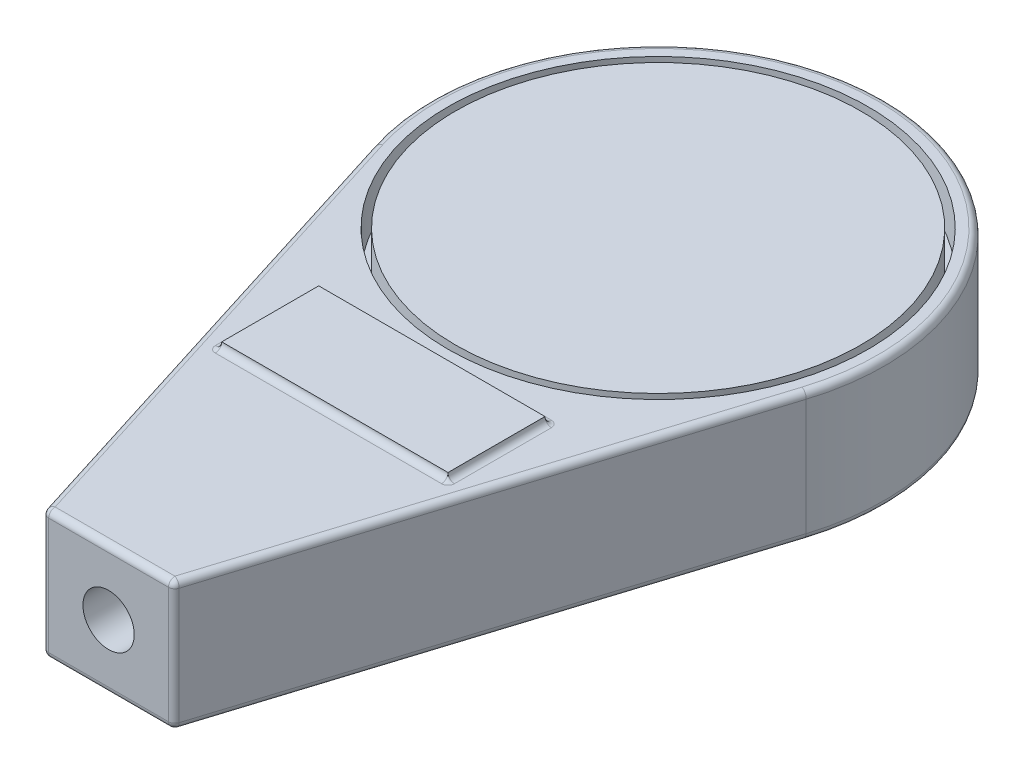
ISO-10303-21;
HEADER;
FILE_DESCRIPTION(('STEP AP214'),'2;1');
FILE_NAME('part.step','',(''),(''),'','','');
FILE_SCHEMA(('AUTOMOTIVE_DESIGN { 1 0 10303 214 1 1 1 1 }'));
ENDSEC;
DATA;
#1=APPLICATION_CONTEXT('core data for automotive mechanical design processes');
#2=APPLICATION_PROTOCOL_DEFINITION('international standard','automotive_design',2000,#1);
#3=PRODUCT_CONTEXT('',#1,'mechanical');
#4=PRODUCT('Part','Part','',(#3));
#5=PRODUCT_RELATED_PRODUCT_CATEGORY('part','',(#4));
#6=PRODUCT_DEFINITION_FORMATION('','',#4);
#7=PRODUCT_DEFINITION_CONTEXT('part definition',#1,'design');
#8=PRODUCT_DEFINITION('design','',#6,#7);
#9=PRODUCT_DEFINITION_SHAPE('','',#8);
#10=(LENGTH_UNIT() NAMED_UNIT(*) SI_UNIT(.MILLI.,.METRE.));
#11=(NAMED_UNIT(*) PLANE_ANGLE_UNIT() SI_UNIT($,.RADIAN.));
#12=(NAMED_UNIT(*) SI_UNIT($,.STERADIAN.) SOLID_ANGLE_UNIT());
#13=UNCERTAINTY_MEASURE_WITH_UNIT(LENGTH_MEASURE(1.E-05),#10,'distance_accuracy_value','');
#14=(GEOMETRIC_REPRESENTATION_CONTEXT(3) GLOBAL_UNCERTAINTY_ASSIGNED_CONTEXT((#13)) GLOBAL_UNIT_ASSIGNED_CONTEXT((#10,
#11,#12)) REPRESENTATION_CONTEXT('',''));
#15=CARTESIAN_POINT('',(0.,0.,0.));
#16=DIRECTION('',(0.,0.,1.));
#17=DIRECTION('',(1.,0.,0.));
#18=AXIS2_PLACEMENT_3D('',#15,#16,#17);
#19=CARTESIAN_POINT('',(0.,20.,0.));
#20=DIRECTION('',(0.,1.,0.));
#21=DIRECTION('',(0.,0.,1.));
#22=AXIS2_PLACEMENT_3D('',#19,#20,#21);
#23=PLANE('',#22);
#24=CARTESIAN_POINT('',(-17.5,20.,35.));
#25=DIRECTION('',(0.,1.,0.));
#26=DIRECTION('',(0.,0.,1.));
#27=AXIS2_PLACEMENT_3D('',#24,#25,#26);
#28=CIRCLE('',#27,1.);
#29=CARTESIAN_POINT('',(-17.5,20.,34.));
#30=VERTEX_POINT('',#29);
#31=CARTESIAN_POINT('',(-18.5,20.,35.));
#32=VERTEX_POINT('',#31);
#33=EDGE_CURVE('E235',#30,#32,#28,.T.);
#34=ORIENTED_EDGE('',*,*,#33,.F.);
#35=DIRECTION('',(1.,0.,0.));
#36=VECTOR('',#35,1.);
#37=CARTESIAN_POINT('',(17.5,20.,34.));
#38=LINE('',#37,#36);
#39=CARTESIAN_POINT('',(17.5,20.,34.));
#40=VERTEX_POINT('',#39);
#41=EDGE_CURVE('E253',#30,#40,#38,.T.);
#42=ORIENTED_EDGE('',*,*,#41,.T.);
#43=CARTESIAN_POINT('',(17.5,20.,35.));
#44=DIRECTION('',(0.,1.,0.));
#45=DIRECTION('',(0.,0.,1.));
#46=AXIS2_PLACEMENT_3D('',#43,#44,#45);
#47=CIRCLE('',#46,1.);
#48=CARTESIAN_POINT('',(18.5,20.,35.));
#49=VERTEX_POINT('',#48);
#50=EDGE_CURVE('E250',#49,#40,#47,.T.);
#51=ORIENTED_EDGE('',*,*,#50,.F.);
#52=DIRECTION('',(0.,0.,1.));
#53=VECTOR('',#52,1.);
#54=CARTESIAN_POINT('',(18.5,20.,50.));
#55=LINE('',#54,#53);
#56=CARTESIAN_POINT('',(18.5,20.,50.));
#57=VERTEX_POINT('',#56);
#58=EDGE_CURVE('E248',#49,#57,#55,.T.);
#59=ORIENTED_EDGE('',*,*,#58,.T.);
#60=CARTESIAN_POINT('',(17.5,20.,50.));
#61=DIRECTION('',(0.,1.,0.));
#62=DIRECTION('',(0.,0.,1.));
#63=AXIS2_PLACEMENT_3D('',#60,#61,#62);
#64=CIRCLE('',#63,1.);
#65=CARTESIAN_POINT('',(17.5,20.,51.));
#66=VERTEX_POINT('',#65);
#67=EDGE_CURVE('E245',#66,#57,#64,.T.);
#68=ORIENTED_EDGE('',*,*,#67,.F.);
#69=DIRECTION('',(1.,0.,0.));
#70=VECTOR('',#69,1.);
#71=CARTESIAN_POINT('',(0.,20.,51.));
#72=LINE('',#71,#70);
#73=CARTESIAN_POINT('',(-17.5,20.,51.));
#74=VERTEX_POINT('',#73);
#75=EDGE_CURVE('E243',#66,#74,#72,.F.);
#76=ORIENTED_EDGE('',*,*,#75,.T.);
#77=CARTESIAN_POINT('',(-17.5,20.,50.));
#78=DIRECTION('',(0.,1.,0.));
#79=DIRECTION('',(0.,0.,1.));
#80=AXIS2_PLACEMENT_3D('',#77,#78,#79);
#81=CIRCLE('',#80,1.);
#82=CARTESIAN_POINT('',(-18.5,20.,50.));
#83=VERTEX_POINT('',#82);
#84=EDGE_CURVE('E240',#83,#74,#81,.T.);
#85=ORIENTED_EDGE('',*,*,#84,.F.);
#86=DIRECTION('',(0.,0.,1.));
#87=VECTOR('',#86,1.);
#88=CARTESIAN_POINT('',(-18.5,20.,0.));
#89=LINE('',#88,#87);
#90=EDGE_CURVE('E238',#83,#32,#89,.F.);
#91=ORIENTED_EDGE('',*,*,#90,.T.);
#92=EDGE_LOOP('',(#34,#42,#51,#59,#68,#76,#85,#91));
#93=FACE_BOUND('',#92,.T.);
#94=DIRECTION('',(1.,0.,0.));
#95=VECTOR('',#94,1.);
#96=CARTESIAN_POINT('',(10.,20.,84.));
#97=LINE('',#96,#95);
#98=CARTESIAN_POINT('',(-9.26581252700777,20.,84.));
#99=VERTEX_POINT('',#98);
#100=CARTESIAN_POINT('',(9.26581252700777,20.,84.));
#101=VERTEX_POINT('',#100);
#102=EDGE_CURVE('E228',#99,#101,#97,.T.);
#103=ORIENTED_EDGE('',*,*,#102,.T.);
#104=DIRECTION('',(0.299518775755541,0.,-0.954090406077905));
#105=VECTOR('',#104,1.);
#106=CARTESIAN_POINT('',(32.4390738066488,20.,10.1836383756884));
#107=LINE('',#106,#105);
#108=CARTESIAN_POINT('',(32.4390738066488,20.,10.1836383756884));
#109=VERTEX_POINT('',#108);
#110=EDGE_CURVE('E232',#101,#109,#107,.T.);
#111=ORIENTED_EDGE('',*,*,#110,.T.);
#112=CARTESIAN_POINT('',(0.,20.,0.));
#113=DIRECTION('',(0.,1.,0.));
#114=DIRECTION('',(0.,0.,1.));
#115=AXIS2_PLACEMENT_3D('',#112,#113,#114);
#116=CIRCLE('',#115,34.);
#117=CARTESIAN_POINT('',(-32.4390738066488,20.,10.1836383756884));
#118=VERTEX_POINT('',#117);
#119=EDGE_CURVE('E230',#109,#118,#116,.T.);
#120=ORIENTED_EDGE('',*,*,#119,.T.);
#121=DIRECTION('',(0.299518775755541,0.,0.954090406077905));
#122=VECTOR('',#121,1.);
#123=CARTESIAN_POINT('',(-9.04590959392208,20.,84.7004812242445));
#124=LINE('',#123,#122);
#125=EDGE_CURVE('E226',#118,#99,#124,.T.);
#126=ORIENTED_EDGE('',*,*,#125,.T.);
#127=EDGE_LOOP('',(#103,#111,#120,#126));
#128=FACE_BOUND('',#127,.T.);
#129=CARTESIAN_POINT('',(0.,20.,0.));
#130=DIRECTION('',(0.,1.,0.));
#131=DIRECTION('',(0.,0.,1.));
#132=AXIS2_PLACEMENT_3D('',#129,#130,#131);
#133=CIRCLE('',#132,32.5);
#134=CARTESIAN_POINT('',(0.,20.,32.5));
#135=VERTEX_POINT('',#134);
#136=EDGE_CURVE('E200',#135,#135,#133,.T.);
#137=ORIENTED_EDGE('',*,*,#136,.F.);
#138=EDGE_LOOP('',(#137));
#139=FACE_BOUND('',#138,.T.);
#140=ADVANCED_FACE('F51',(#93,#128,#139),#23,.T.);
#141=CARTESIAN_POINT('',(0.,20.,0.));
#142=DIRECTION('',(0.,-1.,0.));
#143=DIRECTION('',(0.,0.,-1.));
#144=AXIS2_PLACEMENT_3D('',#141,#142,#143);
#145=CYLINDRICAL_SURFACE('',#144,35.);
#146=DIRECTION('',(0.,-1.,0.));
#147=VECTOR('',#146,1.);
#148=CARTESIAN_POINT('',(33.3931642127267,120.065845984876,10.4831571514439));
#149=LINE('',#148,#147);
#150=CARTESIAN_POINT('',(33.3931642127267,19.,10.4831571514439));
#151=VERTEX_POINT('',#150);
#152=CARTESIAN_POINT('',(33.3931642127267,1.,10.4831571514439));
#153=VERTEX_POINT('',#152);
#154=EDGE_CURVE('E189',#151,#153,#149,.T.);
#155=ORIENTED_EDGE('',*,*,#154,.T.);
#156=CARTESIAN_POINT('',(0.,1.,0.));
#157=DIRECTION('',(0.,1.,0.));
#158=DIRECTION('',(0.,0.,1.));
#159=AXIS2_PLACEMENT_3D('',#156,#157,#158);
#160=CIRCLE('',#159,35.);
#161=CARTESIAN_POINT('',(-33.3931642127267,1.,10.4831571514439));
#162=VERTEX_POINT('',#161);
#163=EDGE_CURVE('E224',#153,#162,#160,.T.);
#164=ORIENTED_EDGE('',*,*,#163,.T.);
#165=DIRECTION('',(0.,-1.,0.));
#166=VECTOR('',#165,1.);
#167=CARTESIAN_POINT('',(-33.3931642127267,120.065845984876,10.4831571514439));
#168=LINE('',#167,#166);
#169=CARTESIAN_POINT('',(-33.3931642127267,19.,10.4831571514439));
#170=VERTEX_POINT('',#169);
#171=EDGE_CURVE('E190',#170,#162,#168,.T.);
#172=ORIENTED_EDGE('',*,*,#171,.F.);
#173=CARTESIAN_POINT('',(0.,19.,0.));
#174=DIRECTION('',(0.,1.,0.));
#175=DIRECTION('',(0.,0.,1.));
#176=AXIS2_PLACEMENT_3D('',#173,#174,#175);
#177=CIRCLE('',#176,35.);
#178=EDGE_CURVE('E222',#170,#151,#177,.F.);
#179=ORIENTED_EDGE('',*,*,#178,.T.);
#180=EDGE_LOOP('',(#155,#164,#172,#179));
#181=FACE_BOUND('',#180,.T.);
#182=ADVANCED_FACE('F372',(#181),#145,.T.);
#183=CARTESIAN_POINT('',(0.,0.,0.));
#184=DIRECTION('',(0.,1.,0.));
#185=DIRECTION('',(0.,0.,1.));
#186=AXIS2_PLACEMENT_3D('',#183,#184,#185);
#187=PLANE('',#186);
#188=CARTESIAN_POINT('',(0.,0.,0.));
#189=DIRECTION('',(0.,1.,0.));
#190=DIRECTION('',(0.,0.,1.));
#191=AXIS2_PLACEMENT_3D('',#188,#189,#190);
#192=CIRCLE('',#191,34.);
#193=CARTESIAN_POINT('',(-32.4390738066488,0.,10.1836383756884));
#194=VERTEX_POINT('',#193);
#195=CARTESIAN_POINT('',(32.4390738066488,0.,10.1836383756884));
#196=VERTEX_POINT('',#195);
#197=EDGE_CURVE('E217',#194,#196,#192,.F.);
#198=ORIENTED_EDGE('',*,*,#197,.T.);
#199=DIRECTION('',(0.299518775755541,0.,-0.954090406077905));
#200=VECTOR('',#199,1.);
#201=CARTESIAN_POINT('',(32.4390738066488,0.,10.1836383756884));
#202=LINE('',#201,#200);
#203=CARTESIAN_POINT('',(9.26581252700778,0.,84.));
#204=VERTEX_POINT('',#203);
#205=EDGE_CURVE('E219',#196,#204,#202,.F.);
#206=ORIENTED_EDGE('',*,*,#205,.T.);
#207=DIRECTION('',(1.,0.,0.));
#208=VECTOR('',#207,1.);
#209=CARTESIAN_POINT('',(0.,0.,84.));
#210=LINE('',#209,#208);
#211=CARTESIAN_POINT('',(-9.26581252700777,0.,84.));
#212=VERTEX_POINT('',#211);
#213=EDGE_CURVE('E215',#204,#212,#210,.F.);
#214=ORIENTED_EDGE('',*,*,#213,.T.);
#215=DIRECTION('',(0.299518775755541,0.,0.954090406077905));
#216=VECTOR('',#215,1.);
#217=CARTESIAN_POINT('',(-32.4390738066488,0.,10.1836383756884));
#218=LINE('',#217,#216);
#219=EDGE_CURVE('E213',#212,#194,#218,.F.);
#220=ORIENTED_EDGE('',*,*,#219,.T.);
#221=EDGE_LOOP('',(#198,#206,#214,#220));
#222=FACE_BOUND('',#221,.T.);
#223=ADVANCED_FACE('F379',(#222),#187,.F.);
#224=CARTESIAN_POINT('',(0.,13.5,0.));
#225=DIRECTION('',(0.,1.,0.));
#226=DIRECTION('',(0.,0.,1.));
#227=AXIS2_PLACEMENT_3D('',#224,#225,#226);
#228=CYLINDRICAL_SURFACE('',#227,32.5);
#229=CARTESIAN_POINT('',(0.,13.5,0.));
#230=DIRECTION('',(0.,1.,0.));
#231=DIRECTION('',(0.,0.,1.));
#232=AXIS2_PLACEMENT_3D('',#229,#230,#231);
#233=CIRCLE('',#232,32.5);
#234=CARTESIAN_POINT('',(0.,13.5,32.5));
#235=VERTEX_POINT('',#234);
#236=EDGE_CURVE('E201',#235,#235,#233,.T.);
#237=CARTESIAN_POINT('',(0.,13.5,32.5));
#238=CARTESIAN_POINT('',(0.,13.5677083333333,32.5));
#239=CARTESIAN_POINT('',(0.,13.6354166666667,32.5));
#240=CARTESIAN_POINT('',(0.,13.7708333333333,32.5));
#241=CARTESIAN_POINT('',(0.,13.8385416666667,32.5));
#242=CARTESIAN_POINT('',(0.,13.9739583333333,32.5));
#243=CARTESIAN_POINT('',(0.,14.0416666666667,32.5));
#244=CARTESIAN_POINT('',(0.,14.1770833333333,32.5));
#245=CARTESIAN_POINT('',(0.,14.2447916666667,32.5));
#246=CARTESIAN_POINT('',(0.,14.3802083333333,32.5));
#247=CARTESIAN_POINT('',(0.,14.4479166666667,32.5));
#248=CARTESIAN_POINT('',(0.,14.5833333333333,32.5));
#249=CARTESIAN_POINT('',(0.,14.6510416666667,32.5));
#250=CARTESIAN_POINT('',(0.,14.7864583333333,32.5));
#251=CARTESIAN_POINT('',(0.,14.8541666666667,32.5));
#252=CARTESIAN_POINT('',(0.,14.9895833333333,32.5));
#253=CARTESIAN_POINT('',(0.,15.0572916666667,32.5));
#254=CARTESIAN_POINT('',(0.,15.1927083333333,32.5));
#255=CARTESIAN_POINT('',(0.,15.2604166666667,32.5));
#256=CARTESIAN_POINT('',(0.,15.3958333333333,32.5));
#257=CARTESIAN_POINT('',(0.,15.4635416666667,32.5));
#258=CARTESIAN_POINT('',(0.,15.5989583333333,32.5));
#259=CARTESIAN_POINT('',(0.,15.6666666666667,32.5));
#260=CARTESIAN_POINT('',(0.,15.8020833333333,32.5));
#261=CARTESIAN_POINT('',(0.,15.8697916666667,32.5));
#262=CARTESIAN_POINT('',(0.,16.0052083333333,32.5));
#263=CARTESIAN_POINT('',(0.,16.0729166666667,32.5));
#264=CARTESIAN_POINT('',(0.,16.2083333333333,32.5));
#265=CARTESIAN_POINT('',(0.,16.2760416666667,32.5));
#266=CARTESIAN_POINT('',(0.,16.4114583333333,32.5));
#267=CARTESIAN_POINT('',(0.,16.4791666666667,32.5));
#268=CARTESIAN_POINT('',(0.,16.6145833333333,32.5));
#269=CARTESIAN_POINT('',(0.,16.6822916666667,32.5));
#270=CARTESIAN_POINT('',(0.,16.8177083333333,32.5));
#271=CARTESIAN_POINT('',(0.,16.8854166666667,32.5));
#272=CARTESIAN_POINT('',(0.,17.0208333333333,32.5));
#273=CARTESIAN_POINT('',(0.,17.0885416666667,32.5));
#274=CARTESIAN_POINT('',(0.,17.2239583333333,32.5));
#275=CARTESIAN_POINT('',(0.,17.2916666666667,32.5));
#276=CARTESIAN_POINT('',(0.,17.4270833333333,32.5));
#277=CARTESIAN_POINT('',(0.,17.4947916666667,32.5));
#278=CARTESIAN_POINT('',(0.,17.6302083333333,32.5));
#279=CARTESIAN_POINT('',(0.,17.6979166666667,32.5));
#280=CARTESIAN_POINT('',(0.,17.8333333333333,32.5));
#281=CARTESIAN_POINT('',(0.,17.9010416666667,32.5));
#282=CARTESIAN_POINT('',(0.,18.0364583333333,32.5));
#283=CARTESIAN_POINT('',(0.,18.1041666666667,32.5));
#284=CARTESIAN_POINT('',(0.,18.2395833333333,32.5));
#285=CARTESIAN_POINT('',(0.,18.3072916666667,32.5));
#286=CARTESIAN_POINT('',(0.,18.4427083333333,32.5));
#287=CARTESIAN_POINT('',(0.,18.5104166666667,32.5));
#288=CARTESIAN_POINT('',(0.,18.6458333333333,32.5));
#289=CARTESIAN_POINT('',(0.,18.7135416666667,32.5));
#290=CARTESIAN_POINT('',(0.,18.8489583333333,32.5));
#291=CARTESIAN_POINT('',(0.,18.9166666666667,32.5));
#292=CARTESIAN_POINT('',(0.,19.0520833333333,32.5));
#293=CARTESIAN_POINT('',(0.,19.1197916666667,32.5));
#294=CARTESIAN_POINT('',(0.,19.2552083333333,32.5));
#295=CARTESIAN_POINT('',(0.,19.3229166666667,32.5));
#296=CARTESIAN_POINT('',(0.,19.4583333333333,32.5));
#297=CARTESIAN_POINT('',(0.,19.5260416666667,32.5));
#298=CARTESIAN_POINT('',(0.,19.6614583333333,32.5));
#299=CARTESIAN_POINT('',(0.,19.7291666666667,32.5));
#300=CARTESIAN_POINT('',(0.,19.8645833333333,32.5));
#301=CARTESIAN_POINT('',(0.,19.9322916666667,32.5));
#302=CARTESIAN_POINT('',(0.,20.,32.5));
#303=B_SPLINE_CURVE_WITH_KNOTS('',3,(#237,#238,#239,#240,#241,#242,#243,#244,#245,#246,#247,
#248,#249,#250,#251,#252,#253,#254,#255,#256,#257,#258,#259,#260,#261,#262,#263,#264,#265,#266,
#267,#268,#269,#270,#271,#272,#273,#274,#275,#276,#277,#278,#279,#280,#281,#282,#283,#284,#285,
#286,#287,#288,#289,#290,#291,#292,#293,#294,#295,#296,#297,#298,#299,#300,#301,#302),
.UNSPECIFIED.,.F.,.F.,(4,2,2,2,2,2,2,2,2,2,2,2,2,2,2,2,2,2,2,2,2,2,2,2,2,2,2,2,2,2,2,2,4),(0.,
0.203125,0.40625,0.609375000000001,0.812500000000001,1.015625,1.21875,1.421875,1.625,1.828125,
2.03125,2.234375,2.4375,2.640625,2.84375,3.046875,3.25,3.453125,3.65625,3.859375,4.0625,
4.265625,4.46875,4.671875,4.875,5.078125,5.28125,5.484375,5.6875,5.890625,6.09375,6.296875,6.5),.UNSPECIFIED.);
#304=EDGE_CURVE('BSEAM384',#235,#135,#303,.T.);
#305=ORIENTED_EDGE('',*,*,#236,.F.);
#306=ORIENTED_EDGE('',*,*,#136,.T.);
#307=ORIENTED_EDGE('',*,*,#304,.T.);
#308=ORIENTED_EDGE('',*,*,#304,.F.);
#309=EDGE_LOOP('',(#305,#307,#306,#308));
#310=FACE_BOUND('',#309,.T.);
#311=ADVANCED_FACE('F384',(#310),#228,.F.);
#312=CARTESIAN_POINT('',(0.,13.5,0.));
#313=DIRECTION('',(0.,1.,0.));
#314=DIRECTION('',(0.,0.,1.));
#315=AXIS2_PLACEMENT_3D('',#312,#313,#314);
#316=PLANE('',#315);
#317=CARTESIAN_POINT('',(0.,13.5,0.));
#318=DIRECTION('',(0.,1.,0.));
#319=DIRECTION('',(0.,0.,1.));
#320=AXIS2_PLACEMENT_3D('',#317,#318,#319);
#321=CIRCLE('',#320,31.35);
#322=CARTESIAN_POINT('',(0.,13.5,31.35));
#323=VERTEX_POINT('',#322);
#324=EDGE_CURVE('E192',#323,#323,#321,.T.);
#325=ORIENTED_EDGE('',*,*,#324,.F.);
#326=EDGE_LOOP('',(#325));
#327=FACE_BOUND('',#326,.T.);
#328=ORIENTED_EDGE('',*,*,#236,.T.);
#329=EDGE_LOOP('',(#328));
#330=FACE_BOUND('',#329,.T.);
#331=ADVANCED_FACE('F505',(#327,#330),#316,.T.);
#332=CARTESIAN_POINT('',(0.,108.671190360793,0.));
#333=DIRECTION('',(0.,-1.,0.));
#334=DIRECTION('',(0.,0.,-1.));
#335=AXIS2_PLACEMENT_3D('',#332,#333,#334);
#336=CYLINDRICAL_SURFACE('',#335,31.35);
#337=ORIENTED_EDGE('',*,*,#324,.T.);
#338=EDGE_LOOP('',(#337));
#339=FACE_BOUND('',#338,.T.);
#340=CARTESIAN_POINT('',(0.,20.,0.));
#341=DIRECTION('',(0.,1.,0.));
#342=DIRECTION('',(0.,0.,1.));
#343=AXIS2_PLACEMENT_3D('',#340,#341,#342);
#344=CIRCLE('',#343,31.35);
#345=CARTESIAN_POINT('',(0.,20.,31.35));
#346=VERTEX_POINT('',#345);
#347=EDGE_CURVE('E197',#346,#346,#344,.T.);
#348=ORIENTED_EDGE('',*,*,#347,.F.);
#349=EDGE_LOOP('',(#348));
#350=FACE_BOUND('',#349,.T.);
#351=ADVANCED_FACE('F502',(#339,#350),#336,.T.);
#352=CARTESIAN_POINT('',(0.,20.,0.));
#353=DIRECTION('',(0.,1.,0.));
#354=DIRECTION('',(0.,0.,1.));
#355=AXIS2_PLACEMENT_3D('',#352,#353,#354);
#356=PLANE('',#355);
#357=ORIENTED_EDGE('',*,*,#347,.T.);
#358=EDGE_LOOP('',(#357));
#359=FACE_BOUND('',#358,.T.);
#360=ADVANCED_FACE('F498',(#359),#356,.T.);
#361=CARTESIAN_POINT('',(-33.3931642127267,120.065845984876,10.4831571514439));
#362=DIRECTION('',(0.954090406077905,0.,-0.299518775755541));
#363=DIRECTION('',(-0.299518775755541,0.,-0.954090406077905));
#364=AXIS2_PLACEMENT_3D('',#361,#362,#363);
#365=PLANE('',#364);
#366=ORIENTED_EDGE('',*,*,#171,.T.);
#367=DIRECTION('',(0.299518775755541,0.,0.954090406077905));
#368=VECTOR('',#367,1.);
#369=CARTESIAN_POINT('',(-33.3931642127267,1.,10.4831571514439));
#370=LINE('',#369,#368);
#371=CARTESIAN_POINT('',(-10.2199029330857,1.,84.2995187757555));
#372=VERTEX_POINT('',#371);
#373=EDGE_CURVE('E13',#162,#372,#370,.T.);
#374=ORIENTED_EDGE('',*,*,#373,.T.);
#375=DIRECTION('',(0.,-1.,0.));
#376=VECTOR('',#375,1.);
#377=CARTESIAN_POINT('',(-10.2199029330857,120.065845984876,84.2995187757556));
#378=LINE('',#377,#376);
#379=CARTESIAN_POINT('',(-10.2199029330857,19.,84.2995187757555));
#380=VERTEX_POINT('',#379);
#381=EDGE_CURVE('E60',#372,#380,#378,.F.);
#382=ORIENTED_EDGE('',*,*,#381,.T.);
#383=DIRECTION('',(0.299518775755541,0.,0.954090406077905));
#384=VECTOR('',#383,1.);
#385=CARTESIAN_POINT('',(-33.3931642127267,19.,10.4831571514439));
#386=LINE('',#385,#384);
#387=EDGE_CURVE('E265',#380,#170,#386,.F.);
#388=ORIENTED_EDGE('',*,*,#387,.T.);
#389=EDGE_LOOP('',(#366,#374,#382,#388));
#390=FACE_BOUND('',#389,.T.);
#391=ADVANCED_FACE('F477',(#390),#365,.F.);
#392=CARTESIAN_POINT('',(0.,120.065845984876,85.));
#393=DIRECTION('',(0.,0.,-1.));
#394=DIRECTION('',(-1.,0.,0.));
#395=AXIS2_PLACEMENT_3D('',#392,#393,#394);
#396=PLANE('',#395);
#397=DIRECTION('',(1.,0.,0.));
#398=VECTOR('',#397,1.);
#399=CARTESIAN_POINT('',(0.,1.,85.));
#400=LINE('',#399,#398);
#401=CARTESIAN_POINT('',(-9.26581252700778,1.,85.));
#402=VERTEX_POINT('',#401);
#403=CARTESIAN_POINT('',(9.26581252700778,1.,85.));
#404=VERTEX_POINT('',#403);
#405=EDGE_CURVE('E260',#402,#404,#400,.T.);
#406=ORIENTED_EDGE('',*,*,#405,.T.);
#407=DIRECTION('',(0.,-1.,0.));
#408=VECTOR('',#407,1.);
#409=CARTESIAN_POINT('',(9.26581252700778,120.065845984876,85.));
#410=LINE('',#409,#408);
#411=CARTESIAN_POINT('',(9.26581252700778,19.,85.));
#412=VERTEX_POINT('',#411);
#413=EDGE_CURVE('E262',#404,#412,#410,.F.);
#414=ORIENTED_EDGE('',*,*,#413,.T.);
#415=DIRECTION('',(1.,0.,0.));
#416=VECTOR('',#415,1.);
#417=CARTESIAN_POINT('',(-9.99999999999999,19.,85.));
#418=LINE('',#417,#416);
#419=CARTESIAN_POINT('',(-9.26581252700778,19.,85.));
#420=VERTEX_POINT('',#419);
#421=EDGE_CURVE('E256',#412,#420,#418,.F.);
#422=ORIENTED_EDGE('',*,*,#421,.T.);
#423=DIRECTION('',(0.,-1.,0.));
#424=VECTOR('',#423,1.);
#425=CARTESIAN_POINT('',(-9.26581252700778,120.065845984876,85.));
#426=LINE('',#425,#424);
#427=EDGE_CURVE('E258',#420,#402,#426,.T.);
#428=ORIENTED_EDGE('',*,*,#427,.T.);
#429=EDGE_LOOP('',(#406,#414,#422,#428));
#430=FACE_BOUND('',#429,.T.);
#431=CARTESIAN_POINT('',(0.,10.,85.));
#432=DIRECTION('',(0.,0.,1.));
#433=DIRECTION('',(1.,0.,0.));
#434=AXIS2_PLACEMENT_3D('',#431,#432,#433);
#435=CIRCLE('',#434,3.96874999999999);
#436=CARTESIAN_POINT('',(3.96874999999999,10.,85.));
#437=VERTEX_POINT('',#436);
#438=EDGE_CURVE('E174',#437,#437,#435,.T.);
#439=ORIENTED_EDGE('',*,*,#438,.F.);
#440=EDGE_LOOP('',(#439));
#441=FACE_BOUND('',#440,.T.);
#442=ADVANCED_FACE('F484',(#430,#441),#396,.F.);
#443=CARTESIAN_POINT('',(33.3931642127267,120.065845984876,10.4831571514439));
#444=DIRECTION('',(-0.954090406077905,0.,-0.299518775755541));
#445=DIRECTION('',(-0.299518775755541,0.,0.954090406077905));
#446=AXIS2_PLACEMENT_3D('',#443,#444,#445);
#447=PLANE('',#446);
#448=DIRECTION('',(0.,-1.,0.));
#449=VECTOR('',#448,1.);
#450=CARTESIAN_POINT('',(10.2199029330857,120.065845984876,84.2995187757556));
#451=LINE('',#450,#449);
#452=CARTESIAN_POINT('',(10.2199029330857,19.,84.2995187757555));
#453=VERTEX_POINT('',#452);
#454=CARTESIAN_POINT('',(10.2199029330857,1.,84.2995187757555));
#455=VERTEX_POINT('',#454);
#456=EDGE_CURVE('E204',#453,#455,#451,.T.);
#457=ORIENTED_EDGE('',*,*,#456,.T.);
#458=DIRECTION('',(0.299518775755541,0.,-0.954090406077905));
#459=VECTOR('',#458,1.);
#460=CARTESIAN_POINT('',(33.3931642127267,1.,10.4831571514439));
#461=LINE('',#460,#459);
#462=EDGE_CURVE('E210',#455,#153,#461,.T.);
#463=ORIENTED_EDGE('',*,*,#462,.T.);
#464=ORIENTED_EDGE('',*,*,#154,.F.);
#465=DIRECTION('',(0.299518775755541,0.,-0.954090406077905));
#466=VECTOR('',#465,1.);
#467=CARTESIAN_POINT('',(9.99999999999999,19.,85.));
#468=LINE('',#467,#466);
#469=EDGE_CURVE('E208',#151,#453,#468,.F.);
#470=ORIENTED_EDGE('',*,*,#469,.T.);
#471=EDGE_LOOP('',(#457,#463,#464,#470));
#472=FACE_BOUND('',#471,.T.);
#473=ADVANCED_FACE('F467',(#472),#447,.F.);
#474=CARTESIAN_POINT('',(0.,21.,0.));
#475=DIRECTION('',(0.,1.,0.));
#476=DIRECTION('',(0.,0.,1.));
#477=AXIS2_PLACEMENT_3D('',#474,#475,#476);
#478=PLANE('',#477);
#479=DIRECTION('',(0.,0.,1.));
#480=VECTOR('',#479,1.);
#481=CARTESIAN_POINT('',(-17.5,21.,35.));
#482=LINE('',#481,#480);
#483=CARTESIAN_POINT('',(-17.5,21.,35.));
#484=VERTEX_POINT('',#483);
#485=CARTESIAN_POINT('',(-17.5,21.,50.));
#486=VERTEX_POINT('',#485);
#487=EDGE_CURVE('E173',#484,#486,#482,.T.);
#488=ORIENTED_EDGE('',*,*,#487,.T.);
#489=DIRECTION('',(1.,0.,0.));
#490=VECTOR('',#489,1.);
#491=CARTESIAN_POINT('',(-17.5,21.,50.));
#492=LINE('',#491,#490);
#493=CARTESIAN_POINT('',(17.5,21.,50.));
#494=VERTEX_POINT('',#493);
#495=EDGE_CURVE('E176',#486,#494,#492,.T.);
#496=ORIENTED_EDGE('',*,*,#495,.T.);
#497=DIRECTION('',(0.,0.,1.));
#498=VECTOR('',#497,1.);
#499=CARTESIAN_POINT('',(17.5,21.,35.));
#500=LINE('',#499,#498);
#501=CARTESIAN_POINT('',(17.5,21.,35.));
#502=VERTEX_POINT('',#501);
#503=EDGE_CURVE('E183',#502,#494,#500,.T.);
#504=ORIENTED_EDGE('',*,*,#503,.F.);
#505=DIRECTION('',(1.,0.,0.));
#506=VECTOR('',#505,1.);
#507=CARTESIAN_POINT('',(-17.5,21.,35.));
#508=LINE('',#507,#506);
#509=EDGE_CURVE('E186',#484,#502,#508,.T.);
#510=ORIENTED_EDGE('',*,*,#509,.F.);
#511=EDGE_LOOP('',(#488,#496,#504,#510));
#512=FACE_BOUND('',#511,.T.);
#513=ADVANCED_FACE('F167',(#512),#478,.T.);
#514=CARTESIAN_POINT('',(0.,10.,45.));
#515=DIRECTION('',(0.,0.,1.));
#516=DIRECTION('',(1.,0.,0.));
#517=AXIS2_PLACEMENT_3D('',#514,#515,#516);
#518=CONICAL_SURFACE('',#517,3.96874999999999,1.02974425867665);
#519=CARTESIAN_POINT('',(0.,10.,42.6153344182344));
#520=VERTEX_POINT('',#519);
#521=VERTEX_LOOP('',#520);
#522=FACE_BOUND('',#521,.T.);
#523=CARTESIAN_POINT('',(0.,10.,45.));
#524=DIRECTION('',(0.,0.,1.));
#525=DIRECTION('',(1.,0.,0.));
#526=AXIS2_PLACEMENT_3D('',#523,#524,#525);
#527=CIRCLE('',#526,3.96874999999999);
#528=CARTESIAN_POINT('',(3.96874999999999,10.,45.));
#529=VERTEX_POINT('',#528);
#530=EDGE_CURVE('E171',#529,#529,#527,.T.);
#531=ORIENTED_EDGE('',*,*,#530,.T.);
#532=EDGE_LOOP('',(#531));
#533=FACE_BOUND('',#532,.T.);
#534=ADVANCED_FACE('F163',(#522,#533),#518,.F.);
#535=CARTESIAN_POINT('',(0.,10.,85.));
#536=DIRECTION('',(0.,0.,1.));
#537=DIRECTION('',(1.,0.,0.));
#538=AXIS2_PLACEMENT_3D('',#535,#536,#537);
#539=CYLINDRICAL_SURFACE('',#538,3.96874999999999);
#540=ORIENTED_EDGE('',*,*,#530,.F.);
#541=EDGE_LOOP('',(#540));
#542=FACE_BOUND('',#541,.T.);
#543=ORIENTED_EDGE('',*,*,#438,.T.);
#544=EDGE_LOOP('',(#543));
#545=FACE_BOUND('',#544,.T.);
#546=ADVANCED_FACE('F166',(#542,#545),#539,.F.);
#547=CARTESIAN_POINT('',(-32.4390738066488,19.,10.1836383756884));
#548=DIRECTION('',(-0.299518775755541,0.,-0.954090406077905));
#549=DIRECTION('',(-0.954090406077905,0.,0.299518775755541));
#550=AXIS2_PLACEMENT_3D('',#547,#548,#549);
#551=CYLINDRICAL_SURFACE('',#550,1.);
#552=CARTESIAN_POINT('',(-9.26581252700777,19.,84.));
#553=DIRECTION('',(0.29951877575554,0.,0.954090406077905));
#554=DIRECTION('',(0.954090406077906,0.,-0.29951877575554));
#555=AXIS2_PLACEMENT_3D('',#552,#553,#554);
#556=CIRCLE('',#555,1.);
#557=EDGE_CURVE('E306',#99,#380,#556,.T.);
#558=ORIENTED_EDGE('',*,*,#557,.F.);
#559=ORIENTED_EDGE('',*,*,#125,.F.);
#560=CARTESIAN_POINT('',(-32.4390738066488,19.,10.1836383756884));
#561=DIRECTION('',(-0.29951877575554,0.,-0.954090406077905));
#562=DIRECTION('',(-0.954090406077906,0.,0.29951877575554));
#563=AXIS2_PLACEMENT_3D('',#560,#561,#562);
#564=CIRCLE('',#563,1.);
#565=EDGE_CURVE('E179',#170,#118,#564,.T.);
#566=ORIENTED_EDGE('',*,*,#565,.F.);
#567=ORIENTED_EDGE('',*,*,#387,.F.);
#568=EDGE_LOOP('',(#558,#559,#566,#567));
#569=FACE_BOUND('',#568,.T.);
#570=ADVANCED_FACE('F439',(#569),#551,.T.);
#571=CARTESIAN_POINT('',(0.,19.,0.));
#572=DIRECTION('',(0.,1.,0.));
#573=DIRECTION('',(0.,0.,1.));
#574=AXIS2_PLACEMENT_3D('',#571,#572,#573);
#575=TOROIDAL_SURFACE('',#574,34.,1.);
#576=ORIENTED_EDGE('',*,*,#565,.T.);
#577=ORIENTED_EDGE('',*,*,#119,.F.);
#578=CARTESIAN_POINT('',(32.4390738066488,19.,10.1836383756884));
#579=DIRECTION('',(-0.29951877575554,0.,0.954090406077905));
#580=DIRECTION('',(0.954090406077906,0.,0.29951877575554));
#581=AXIS2_PLACEMENT_3D('',#578,#579,#580);
#582=CIRCLE('',#581,1.);
#583=EDGE_CURVE('E301',#151,#109,#582,.T.);
#584=ORIENTED_EDGE('',*,*,#583,.F.);
#585=ORIENTED_EDGE('',*,*,#178,.F.);
#586=EDGE_LOOP('',(#576,#577,#584,#585));
#587=FACE_BOUND('',#586,.T.);
#588=ADVANCED_FACE('F435',(#587),#575,.T.);
#589=CARTESIAN_POINT('',(-9.26581252700778,19.,84.));
#590=DIRECTION('',(0.,0.,1.));
#591=DIRECTION('',(1.,0.,0.));
#592=AXIS2_PLACEMENT_3D('',#589,#590,#591);
#593=SPHERICAL_SURFACE('',#592,1.);
#594=CARTESIAN_POINT('',(-9.26581252700778,19.,84.));
#595=DIRECTION('',(0.,1.,0.));
#596=DIRECTION('',(0.,0.,1.));
#597=AXIS2_PLACEMENT_3D('',#594,#595,#596);
#598=CIRCLE('',#597,1.);
#599=EDGE_CURVE('E298',#420,#380,#598,.F.);
#600=ORIENTED_EDGE('',*,*,#599,.F.);
#601=CARTESIAN_POINT('',(-9.26581252700778,19.,84.));
#602=DIRECTION('',(-1.,0.,0.));
#603=DIRECTION('',(0.,-1.,0.));
#604=AXIS2_PLACEMENT_3D('',#601,#602,#603);
#605=CIRCLE('',#604,1.);
#606=EDGE_CURVE('E303',#99,#420,#605,.F.);
#607=ORIENTED_EDGE('',*,*,#606,.F.);
#608=ORIENTED_EDGE('',*,*,#557,.T.);
#609=EDGE_LOOP('',(#600,#607,#608));
#610=FACE_BOUND('',#609,.T.);
#611=ADVANCED_FACE('F431',(#610),#593,.T.);
#612=CARTESIAN_POINT('',(0.,19.,84.));
#613=DIRECTION('',(-1.,0.,0.));
#614=DIRECTION('',(0.,0.,1.));
#615=AXIS2_PLACEMENT_3D('',#612,#613,#614);
#616=CYLINDRICAL_SURFACE('',#615,1.);
#617=ORIENTED_EDGE('',*,*,#606,.T.);
#618=ORIENTED_EDGE('',*,*,#421,.F.);
#619=CARTESIAN_POINT('',(9.26581252700777,19.,84.));
#620=DIRECTION('',(1.,0.,0.));
#621=DIRECTION('',(0.,0.,-1.));
#622=AXIS2_PLACEMENT_3D('',#619,#620,#621);
#623=CIRCLE('',#622,1.);
#624=EDGE_CURVE('E295',#101,#412,#623,.T.);
#625=ORIENTED_EDGE('',*,*,#624,.F.);
#626=ORIENTED_EDGE('',*,*,#102,.F.);
#627=EDGE_LOOP('',(#617,#618,#625,#626));
#628=FACE_BOUND('',#627,.T.);
#629=ADVANCED_FACE('F427',(#628),#616,.T.);
#630=CARTESIAN_POINT('',(32.4390738066488,19.,10.1836383756884));
#631=DIRECTION('',(-0.299518775755541,0.,0.954090406077905));
#632=DIRECTION('',(0.954090406077905,0.,0.299518775755541));
#633=AXIS2_PLACEMENT_3D('',#630,#631,#632);
#634=CYLINDRICAL_SURFACE('',#633,1.);
#635=ORIENTED_EDGE('',*,*,#583,.T.);
#636=ORIENTED_EDGE('',*,*,#110,.F.);
#637=CARTESIAN_POINT('',(9.26581252700777,19.,84.));
#638=DIRECTION('',(-0.299518775755542,0.,0.954090406077905));
#639=DIRECTION('',(0.954090406077905,0.,0.299518775755542));
#640=AXIS2_PLACEMENT_3D('',#637,#638,#639);
#641=CIRCLE('',#640,1.);
#642=EDGE_CURVE('E292',#453,#101,#641,.T.);
#643=ORIENTED_EDGE('',*,*,#642,.F.);
#644=ORIENTED_EDGE('',*,*,#469,.F.);
#645=EDGE_LOOP('',(#635,#636,#643,#644));
#646=FACE_BOUND('',#645,.T.);
#647=ADVANCED_FACE('F423',(#646),#634,.T.);
#648=CARTESIAN_POINT('',(-9.26581252700778,120.065845984876,84.));
#649=DIRECTION('',(0.,-1.,0.));
#650=DIRECTION('',(0.,0.,-1.));
#651=AXIS2_PLACEMENT_3D('',#648,#649,#650);
#652=CYLINDRICAL_SURFACE('',#651,1.);
#653=ORIENTED_EDGE('',*,*,#599,.T.);
#654=ORIENTED_EDGE('',*,*,#381,.F.);
#655=CARTESIAN_POINT('',(-9.26581252700778,1.,84.));
#656=DIRECTION('',(0.,-1.,0.));
#657=DIRECTION('',(0.,0.,-1.));
#658=AXIS2_PLACEMENT_3D('',#655,#656,#657);
#659=CIRCLE('',#658,1.);
#660=EDGE_CURVE('E289',#402,#372,#659,.T.);
#661=ORIENTED_EDGE('',*,*,#660,.F.);
#662=ORIENTED_EDGE('',*,*,#427,.F.);
#663=EDGE_LOOP('',(#653,#654,#661,#662));
#664=FACE_BOUND('',#663,.T.);
#665=ADVANCED_FACE('F419',(#664),#652,.T.);
#666=CARTESIAN_POINT('',(9.26581252700778,19.,84.));
#667=DIRECTION('',(0.,0.,1.));
#668=DIRECTION('',(1.,0.,0.));
#669=AXIS2_PLACEMENT_3D('',#666,#667,#668);
#670=SPHERICAL_SURFACE('',#669,1.);
#671=ORIENTED_EDGE('',*,*,#642,.T.);
#672=ORIENTED_EDGE('',*,*,#624,.T.);
#673=CARTESIAN_POINT('',(9.26581252700778,19.,84.));
#674=DIRECTION('',(0.,1.,0.));
#675=DIRECTION('',(0.,0.,1.));
#676=AXIS2_PLACEMENT_3D('',#673,#674,#675);
#677=CIRCLE('',#676,1.);
#678=EDGE_CURVE('E284',#453,#412,#677,.F.);
#679=ORIENTED_EDGE('',*,*,#678,.F.);
#680=EDGE_LOOP('',(#671,#672,#679));
#681=FACE_BOUND('',#680,.T.);
#682=ADVANCED_FACE('F415',(#681),#670,.T.);
#683=CARTESIAN_POINT('',(-9.26581252700778,1.,84.));
#684=DIRECTION('',(0.,0.,1.));
#685=DIRECTION('',(1.,0.,0.));
#686=AXIS2_PLACEMENT_3D('',#683,#684,#685);
#687=SPHERICAL_SURFACE('',#686,1.);
#688=CARTESIAN_POINT('',(-9.26581252700778,1.,84.));
#689=DIRECTION('',(0.299518775755542,0.,0.954090406077905));
#690=DIRECTION('',(0.954090406077905,0.,-0.299518775755542));
#691=AXIS2_PLACEMENT_3D('',#688,#689,#690);
#692=CIRCLE('',#691,1.);
#693=EDGE_CURVE('E281',#212,#372,#692,.F.);
#694=ORIENTED_EDGE('',*,*,#693,.F.);
#695=CARTESIAN_POINT('',(-9.26581252700777,1.,84.));
#696=DIRECTION('',(-1.,0.,0.));
#697=DIRECTION('',(0.,0.,1.));
#698=AXIS2_PLACEMENT_3D('',#695,#696,#697);
#699=CIRCLE('',#698,1.);
#700=EDGE_CURVE('E286',#402,#212,#699,.F.);
#701=ORIENTED_EDGE('',*,*,#700,.F.);
#702=ORIENTED_EDGE('',*,*,#660,.T.);
#703=EDGE_LOOP('',(#694,#701,#702));
#704=FACE_BOUND('',#703,.T.);
#705=ADVANCED_FACE('F411',(#704),#687,.T.);
#706=CARTESIAN_POINT('',(0.,1.,84.));
#707=DIRECTION('',(1.,0.,0.));
#708=DIRECTION('',(0.,0.,-1.));
#709=AXIS2_PLACEMENT_3D('',#706,#707,#708);
#710=CYLINDRICAL_SURFACE('',#709,1.);
#711=ORIENTED_EDGE('',*,*,#700,.T.);
#712=ORIENTED_EDGE('',*,*,#213,.F.);
#713=CARTESIAN_POINT('',(9.26581252700778,1.,84.));
#714=DIRECTION('',(1.,0.,0.));
#715=DIRECTION('',(0.,1.,0.));
#716=AXIS2_PLACEMENT_3D('',#713,#714,#715);
#717=CIRCLE('',#716,1.);
#718=EDGE_CURVE('E278',#404,#204,#717,.T.);
#719=ORIENTED_EDGE('',*,*,#718,.F.);
#720=ORIENTED_EDGE('',*,*,#405,.F.);
#721=EDGE_LOOP('',(#711,#712,#719,#720));
#722=FACE_BOUND('',#721,.T.);
#723=ADVANCED_FACE('F407',(#722),#710,.T.);
#724=CARTESIAN_POINT('',(9.26581252700778,120.065845984876,84.));
#725=DIRECTION('',(0.,-1.,0.));
#726=DIRECTION('',(0.,0.,-1.));
#727=AXIS2_PLACEMENT_3D('',#724,#725,#726);
#728=CYLINDRICAL_SURFACE('',#727,1.);
#729=ORIENTED_EDGE('',*,*,#678,.T.);
#730=ORIENTED_EDGE('',*,*,#413,.F.);
#731=CARTESIAN_POINT('',(9.26581252700777,1.,84.));
#732=DIRECTION('',(0.,-1.,0.));
#733=DIRECTION('',(0.,0.,-1.));
#734=AXIS2_PLACEMENT_3D('',#731,#732,#733);
#735=CIRCLE('',#734,1.);
#736=EDGE_CURVE('E275',#455,#404,#735,.T.);
#737=ORIENTED_EDGE('',*,*,#736,.F.);
#738=ORIENTED_EDGE('',*,*,#456,.F.);
#739=EDGE_LOOP('',(#729,#730,#737,#738));
#740=FACE_BOUND('',#739,.T.);
#741=ADVANCED_FACE('F403',(#740),#728,.T.);
#742=CARTESIAN_POINT('',(-32.4390738066488,1.,10.1836383756884));
#743=DIRECTION('',(0.299518775755541,0.,0.954090406077905));
#744=DIRECTION('',(0.954090406077905,0.,-0.299518775755541));
#745=AXIS2_PLACEMENT_3D('',#742,#743,#744);
#746=CYLINDRICAL_SURFACE('',#745,1.);
#747=ORIENTED_EDGE('',*,*,#693,.T.);
#748=ORIENTED_EDGE('',*,*,#373,.F.);
#749=CARTESIAN_POINT('',(-32.4390738066488,1.,10.1836383756884));
#750=DIRECTION('',(-0.29951877575554,0.,-0.954090406077905));
#751=DIRECTION('',(-0.954090406077906,0.,0.29951877575554));
#752=AXIS2_PLACEMENT_3D('',#749,#750,#751);
#753=CIRCLE('',#752,1.);
#754=EDGE_CURVE('E272',#194,#162,#753,.T.);
#755=ORIENTED_EDGE('',*,*,#754,.F.);
#756=ORIENTED_EDGE('',*,*,#219,.F.);
#757=EDGE_LOOP('',(#747,#748,#755,#756));
#758=FACE_BOUND('',#757,.T.);
#759=ADVANCED_FACE('F399',(#758),#746,.T.);
#760=CARTESIAN_POINT('',(9.26581252700778,1.,84.));
#761=DIRECTION('',(0.,0.,1.));
#762=DIRECTION('',(1.,0.,0.));
#763=AXIS2_PLACEMENT_3D('',#760,#761,#762);
#764=SPHERICAL_SURFACE('',#763,1.);
#765=ORIENTED_EDGE('',*,*,#736,.T.);
#766=ORIENTED_EDGE('',*,*,#718,.T.);
#767=CARTESIAN_POINT('',(9.26581252700778,1.,84.));
#768=DIRECTION('',(-0.299518775755543,0.,0.954090406077904));
#769=DIRECTION('',(0.954090406077905,0.,0.299518775755543));
#770=AXIS2_PLACEMENT_3D('',#767,#768,#769);
#771=CIRCLE('',#770,1.);
#772=EDGE_CURVE('E270',#455,#204,#771,.F.);
#773=ORIENTED_EDGE('',*,*,#772,.F.);
#774=EDGE_LOOP('',(#765,#766,#773));
#775=FACE_BOUND('',#774,.T.);
#776=ADVANCED_FACE('F395',(#775),#764,.T.);
#777=CARTESIAN_POINT('',(0.,1.,0.));
#778=DIRECTION('',(0.,1.,0.));
#779=DIRECTION('',(0.,0.,1.));
#780=AXIS2_PLACEMENT_3D('',#777,#778,#779);
#781=TOROIDAL_SURFACE('',#780,34.,1.);
#782=ORIENTED_EDGE('',*,*,#754,.T.);
#783=ORIENTED_EDGE('',*,*,#163,.F.);
#784=CARTESIAN_POINT('',(32.4390738066488,1.,10.1836383756884));
#785=DIRECTION('',(-0.299518775755538,0.,0.954090406077906));
#786=DIRECTION('',(0.954090406077906,0.,0.299518775755538));
#787=AXIS2_PLACEMENT_3D('',#784,#785,#786);
#788=CIRCLE('',#787,1.);
#789=EDGE_CURVE('E268',#196,#153,#788,.T.);
#790=ORIENTED_EDGE('',*,*,#789,.F.);
#791=ORIENTED_EDGE('',*,*,#197,.F.);
#792=EDGE_LOOP('',(#782,#783,#790,#791));
#793=FACE_BOUND('',#792,.T.);
#794=ADVANCED_FACE('F391',(#793),#781,.T.);
#795=CARTESIAN_POINT('',(32.4390738066488,1.,10.1836383756884));
#796=DIRECTION('',(0.299518775755541,0.,-0.954090406077905));
#797=DIRECTION('',(-0.954090406077905,0.,-0.299518775755541));
#798=AXIS2_PLACEMENT_3D('',#795,#796,#797);
#799=CYLINDRICAL_SURFACE('',#798,1.);
#800=ORIENTED_EDGE('',*,*,#772,.T.);
#801=ORIENTED_EDGE('',*,*,#205,.F.);
#802=ORIENTED_EDGE('',*,*,#789,.T.);
#803=ORIENTED_EDGE('',*,*,#462,.F.);
#804=EDGE_LOOP('',(#800,#801,#802,#803));
#805=FACE_BOUND('',#804,.T.);
#806=ADVANCED_FACE('F388',(#805),#799,.T.);
#807=CARTESIAN_POINT('',(-17.5,21.,51.));
#808=DIRECTION('',(1.,0.,0.));
#809=DIRECTION('',(0.,0.,-1.));
#810=AXIS2_PLACEMENT_3D('',#807,#808,#809);
#811=CYLINDRICAL_SURFACE('',#810,1.);
#812=CARTESIAN_POINT('',(-17.5,21.,51.));
#813=DIRECTION('',(1.,0.,0.));
#814=DIRECTION('',(0.,0.,-1.));
#815=AXIS2_PLACEMENT_3D('',#812,#813,#814);
#816=CIRCLE('',#815,1.);
#817=EDGE_CURVE('E55',#74,#486,#816,.T.);
#818=ORIENTED_EDGE('',*,*,#817,.F.);
#819=ORIENTED_EDGE('',*,*,#75,.F.);
#820=CARTESIAN_POINT('',(17.5,21.,51.));
#821=DIRECTION('',(-1.,0.,0.));
#822=DIRECTION('',(0.,0.,1.));
#823=AXIS2_PLACEMENT_3D('',#820,#821,#822);
#824=CIRCLE('',#823,1.);
#825=EDGE_CURVE('E326',#494,#66,#824,.T.);
#826=ORIENTED_EDGE('',*,*,#825,.F.);
#827=ORIENTED_EDGE('',*,*,#495,.F.);
#828=EDGE_LOOP('',(#818,#819,#826,#827));
#829=FACE_BOUND('',#828,.T.);
#830=ADVANCED_FACE('F53',(#829),#811,.F.);
#831=CARTESIAN_POINT('',(-17.5,21.,50.));
#832=DIRECTION('',(0.,1.,0.));
#833=DIRECTION('',(0.,0.,1.));
#834=AXIS2_PLACEMENT_3D('',#831,#832,#833);
#835=DEGENERATE_TOROIDAL_SURFACE('',#834,1.,1.,.T.);
#836=ORIENTED_EDGE('',*,*,#84,.T.);
#837=ORIENTED_EDGE('',*,*,#817,.T.);
#838=CARTESIAN_POINT('',(-18.5,21.,50.));
#839=DIRECTION('',(0.,0.,-1.));
#840=DIRECTION('',(-1.,0.,0.));
#841=AXIS2_PLACEMENT_3D('',#838,#839,#840);
#842=CIRCLE('',#841,1.);
#843=EDGE_CURVE('E324',#83,#486,#842,.F.);
#844=ORIENTED_EDGE('',*,*,#843,.F.);
#845=EDGE_LOOP('',(#836,#837,#844));
#846=FACE_BOUND('',#845,.T.);
#847=ADVANCED_FACE('F335',(#846),#835,.F.);
#848=CARTESIAN_POINT('',(17.5,21.,50.));
#849=DIRECTION('',(0.,1.,0.));
#850=DIRECTION('',(0.,0.,1.));
#851=AXIS2_PLACEMENT_3D('',#848,#849,#850);
#852=DEGENERATE_TOROIDAL_SURFACE('',#851,1.,1.,.T.);
#853=ORIENTED_EDGE('',*,*,#825,.T.);
#854=ORIENTED_EDGE('',*,*,#67,.T.);
#855=CARTESIAN_POINT('',(18.5,21.,50.));
#856=DIRECTION('',(0.,0.,-1.));
#857=DIRECTION('',(-1.,0.,0.));
#858=AXIS2_PLACEMENT_3D('',#855,#856,#857);
#859=CIRCLE('',#858,1.);
#860=EDGE_CURVE('E321',#494,#57,#859,.F.);
#861=ORIENTED_EDGE('',*,*,#860,.F.);
#862=EDGE_LOOP('',(#853,#854,#861));
#863=FACE_BOUND('',#862,.T.);
#864=ADVANCED_FACE('F348',(#863),#852,.F.);
#865=CARTESIAN_POINT('',(-18.5,21.,35.));
#866=DIRECTION('',(0.,0.,1.));
#867=DIRECTION('',(1.,0.,0.));
#868=AXIS2_PLACEMENT_3D('',#865,#866,#867);
#869=CYLINDRICAL_SURFACE('',#868,1.);
#870=ORIENTED_EDGE('',*,*,#843,.T.);
#871=ORIENTED_EDGE('',*,*,#487,.F.);
#872=CARTESIAN_POINT('',(-18.5,21.,35.));
#873=DIRECTION('',(0.,0.,1.));
#874=DIRECTION('',(1.,0.,0.));
#875=AXIS2_PLACEMENT_3D('',#872,#873,#874);
#876=CIRCLE('',#875,1.);
#877=EDGE_CURVE('E318',#32,#484,#876,.T.);
#878=ORIENTED_EDGE('',*,*,#877,.F.);
#879=ORIENTED_EDGE('',*,*,#90,.F.);
#880=EDGE_LOOP('',(#870,#871,#878,#879));
#881=FACE_BOUND('',#880,.T.);
#882=ADVANCED_FACE('F342',(#881),#869,.F.);
#883=CARTESIAN_POINT('',(18.5,21.,0.));
#884=DIRECTION('',(0.,0.,-1.));
#885=DIRECTION('',(-1.,0.,0.));
#886=AXIS2_PLACEMENT_3D('',#883,#884,#885);
#887=CYLINDRICAL_SURFACE('',#886,1.);
#888=ORIENTED_EDGE('',*,*,#860,.T.);
#889=ORIENTED_EDGE('',*,*,#58,.F.);
#890=CARTESIAN_POINT('',(18.5,21.,35.));
#891=DIRECTION('',(0.,0.,1.));
#892=DIRECTION('',(1.,0.,0.));
#893=AXIS2_PLACEMENT_3D('',#890,#891,#892);
#894=CIRCLE('',#893,1.);
#895=EDGE_CURVE('E315',#502,#49,#894,.T.);
#896=ORIENTED_EDGE('',*,*,#895,.F.);
#897=ORIENTED_EDGE('',*,*,#503,.T.);
#898=EDGE_LOOP('',(#888,#889,#896,#897));
#899=FACE_BOUND('',#898,.T.);
#900=ADVANCED_FACE('F352',(#899),#887,.F.);
#901=CARTESIAN_POINT('',(-17.5,21.,35.));
#902=DIRECTION('',(0.,1.,0.));
#903=DIRECTION('',(0.,0.,1.));
#904=AXIS2_PLACEMENT_3D('',#901,#902,#903);
#905=DEGENERATE_TOROIDAL_SURFACE('',#904,1.,1.,.T.);
#906=ORIENTED_EDGE('',*,*,#33,.T.);
#907=ORIENTED_EDGE('',*,*,#877,.T.);
#908=CARTESIAN_POINT('',(-17.5,21.,34.));
#909=DIRECTION('',(1.,0.,0.));
#910=DIRECTION('',(0.,0.,-1.));
#911=AXIS2_PLACEMENT_3D('',#908,#909,#910);
#912=CIRCLE('',#911,1.);
#913=EDGE_CURVE('E313',#30,#484,#912,.F.);
#914=ORIENTED_EDGE('',*,*,#913,.F.);
#915=EDGE_LOOP('',(#906,#907,#914));
#916=FACE_BOUND('',#915,.T.);
#917=ADVANCED_FACE('F361',(#916),#905,.F.);
#918=CARTESIAN_POINT('',(17.5,21.,35.));
#919=DIRECTION('',(0.,1.,0.));
#920=DIRECTION('',(0.,0.,1.));
#921=AXIS2_PLACEMENT_3D('',#918,#919,#920);
#922=DEGENERATE_TOROIDAL_SURFACE('',#921,1.,1.,.T.);
#923=ORIENTED_EDGE('',*,*,#895,.T.);
#924=ORIENTED_EDGE('',*,*,#50,.T.);
#925=CARTESIAN_POINT('',(17.5,21.,34.));
#926=DIRECTION('',(-1.,0.,0.));
#927=DIRECTION('',(0.,0.,1.));
#928=AXIS2_PLACEMENT_3D('',#925,#926,#927);
#929=CIRCLE('',#928,1.);
#930=EDGE_CURVE('E311',#502,#40,#929,.F.);
#931=ORIENTED_EDGE('',*,*,#930,.F.);
#932=EDGE_LOOP('',(#923,#924,#931));
#933=FACE_BOUND('',#932,.T.);
#934=ADVANCED_FACE('F359',(#933),#922,.F.);
#935=CARTESIAN_POINT('',(0.,21.,34.));
#936=DIRECTION('',(-1.,0.,0.));
#937=DIRECTION('',(0.,0.,1.));
#938=AXIS2_PLACEMENT_3D('',#935,#936,#937);
#939=CYLINDRICAL_SURFACE('',#938,1.);
#940=ORIENTED_EDGE('',*,*,#913,.T.);
#941=ORIENTED_EDGE('',*,*,#509,.T.);
#942=ORIENTED_EDGE('',*,*,#930,.T.);
#943=ORIENTED_EDGE('',*,*,#41,.F.);
#944=EDGE_LOOP('',(#940,#941,#942,#943));
#945=FACE_BOUND('',#944,.T.);
#946=ADVANCED_FACE('F356',(#945),#939,.F.);
#947=CLOSED_SHELL('',(#140,#182,#223,#311,#331,#351,#360,#391,#442,#473,#513,#534,#546,#570,
#588,#611,#629,#647,#665,#682,#705,#723,#741,#759,#776,#794,#806,#830,#847,#864,#882,#900,#917,
#934,#946));
#948=MANIFOLD_SOLID_BREP('B2',#947);
#949=ADVANCED_BREP_SHAPE_REPRESENTATION('',(#18,#948),#14);
#950=SHAPE_DEFINITION_REPRESENTATION(#9,#949);
ENDSEC;
END-ISO-10303-21;
